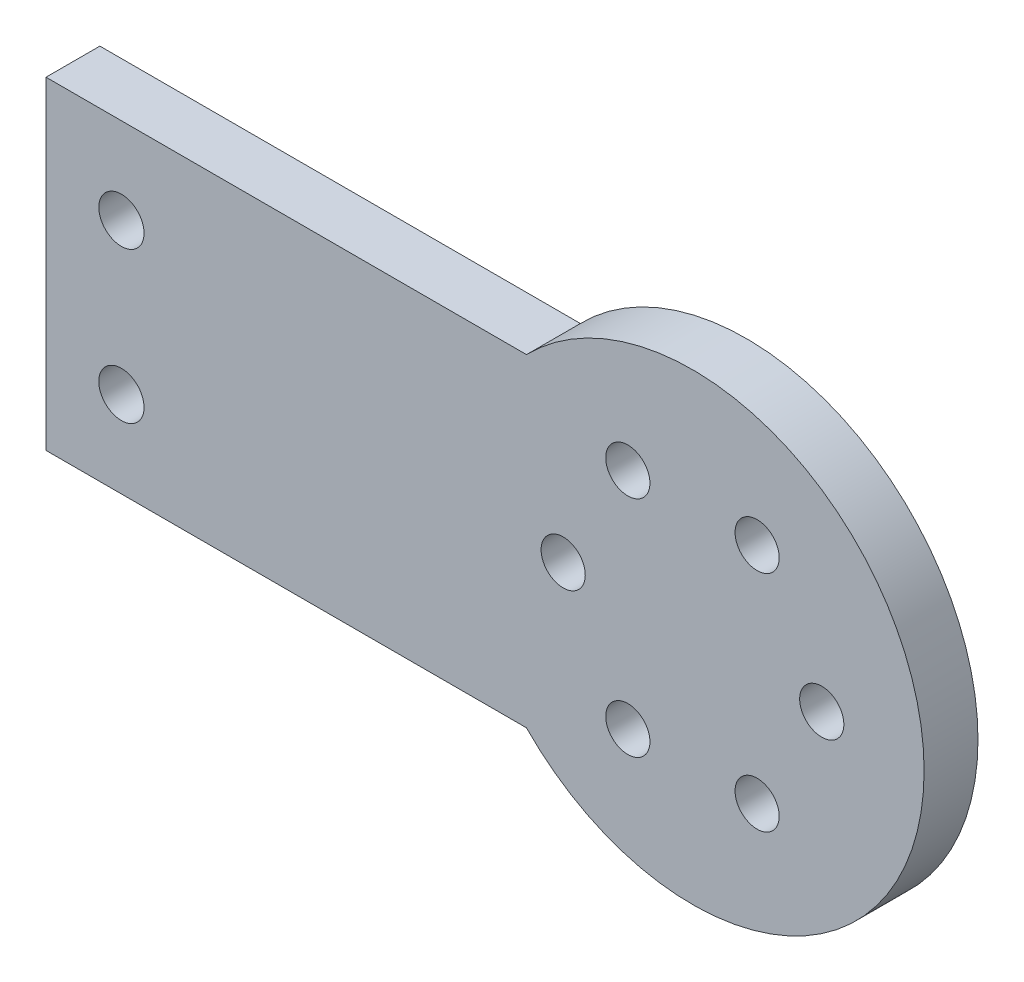
ISO-10303-21;
HEADER;
FILE_DESCRIPTION(('STEP AP214'),'2;1');
FILE_NAME('part.step','',(''),(''),'','','');
FILE_SCHEMA(('AUTOMOTIVE_DESIGN { 1 0 10303 214 1 1 1 1 }'));
ENDSEC;
DATA;
#1=APPLICATION_CONTEXT('core data for automotive mechanical design processes');
#2=APPLICATION_PROTOCOL_DEFINITION('international standard','automotive_design',2000,#1);
#3=PRODUCT_CONTEXT('',#1,'mechanical');
#4=PRODUCT('Part','Part','',(#3));
#5=PRODUCT_RELATED_PRODUCT_CATEGORY('part','',(#4));
#6=PRODUCT_DEFINITION_FORMATION('','',#4);
#7=PRODUCT_DEFINITION_CONTEXT('part definition',#1,'design');
#8=PRODUCT_DEFINITION('design','',#6,#7);
#9=PRODUCT_DEFINITION_SHAPE('','',#8);
#10=(LENGTH_UNIT() NAMED_UNIT(*) SI_UNIT(.MILLI.,.METRE.));
#11=(NAMED_UNIT(*) PLANE_ANGLE_UNIT() SI_UNIT($,.RADIAN.));
#12=(NAMED_UNIT(*) SI_UNIT($,.STERADIAN.) SOLID_ANGLE_UNIT());
#13=UNCERTAINTY_MEASURE_WITH_UNIT(LENGTH_MEASURE(1.E-05),#10,'distance_accuracy_value','');
#14=(GEOMETRIC_REPRESENTATION_CONTEXT(3) GLOBAL_UNCERTAINTY_ASSIGNED_CONTEXT((#13)) GLOBAL_UNIT_ASSIGNED_CONTEXT((#10,
#11,#12)) REPRESENTATION_CONTEXT('',''));
#15=CARTESIAN_POINT('',(0.,0.,0.));
#16=DIRECTION('',(0.,0.,1.));
#17=DIRECTION('',(1.,0.,0.));
#18=AXIS2_PLACEMENT_3D('',#15,#16,#17);
#19=CARTESIAN_POINT('',(0.,0.,5.));
#20=DIRECTION('',(0.,0.,-1.));
#21=DIRECTION('',(-1.,0.,0.));
#22=AXIS2_PLACEMENT_3D('',#19,#20,#21);
#23=PLANE('',#22);
#24=CARTESIAN_POINT('',(-53.,6.99999999999999,5.));
#25=DIRECTION('',(0.,0.,1.));
#26=DIRECTION('',(1.,0.,0.));
#27=AXIS2_PLACEMENT_3D('',#24,#25,#26);
#28=CIRCLE('',#27,2.1);
#29=CARTESIAN_POINT('',(-50.9,6.99999999999999,5.));
#30=VERTEX_POINT('',#29);
#31=EDGE_CURVE('E162',#30,#30,#28,.T.);
#32=ORIENTED_EDGE('',*,*,#31,.F.);
#33=EDGE_LOOP('',(#32));
#34=FACE_BOUND('',#33,.T.);
#35=CARTESIAN_POINT('',(-53.,-7.00000000000001,5.));
#36=DIRECTION('',(0.,0.,1.));
#37=DIRECTION('',(1.,0.,0.));
#38=AXIS2_PLACEMENT_3D('',#35,#36,#37);
#39=CIRCLE('',#38,2.1);
#40=CARTESIAN_POINT('',(-50.9,-7.00000000000001,5.));
#41=VERTEX_POINT('',#40);
#42=EDGE_CURVE('E159',#41,#41,#39,.T.);
#43=ORIENTED_EDGE('',*,*,#42,.F.);
#44=EDGE_LOOP('',(#43));
#45=FACE_BOUND('',#44,.T.);
#46=CARTESIAN_POINT('',(0.,0.,5.));
#47=DIRECTION('',(0.,0.,1.));
#48=DIRECTION('',(-1.,0.,0.));
#49=AXIS2_PLACEMENT_3D('',#46,#47,#48);
#50=CIRCLE('',#49,21.5);
#51=CARTESIAN_POINT('',(-15.4029218007493,-15.,5.));
#52=VERTEX_POINT('',#51);
#53=CARTESIAN_POINT('',(-15.4029218007494,15.,5.));
#54=VERTEX_POINT('',#53);
#55=EDGE_CURVE('E92',#52,#54,#50,.T.);
#56=ORIENTED_EDGE('',*,*,#55,.T.);
#57=DIRECTION('',(-1.,0.,0.));
#58=VECTOR('',#57,1.);
#59=CARTESIAN_POINT('',(-60.,15.,5.));
#60=LINE('',#59,#58);
#61=CARTESIAN_POINT('',(-60.,15.,5.));
#62=VERTEX_POINT('',#61);
#63=EDGE_CURVE('E87',#54,#62,#60,.T.);
#64=ORIENTED_EDGE('',*,*,#63,.T.);
#65=DIRECTION('',(0.,-1.,0.));
#66=VECTOR('',#65,1.);
#67=CARTESIAN_POINT('',(-60.,0.,5.));
#68=LINE('',#67,#66);
#69=CARTESIAN_POINT('',(-60.,-15.,5.));
#70=VERTEX_POINT('',#69);
#71=EDGE_CURVE('E90',#62,#70,#68,.T.);
#72=ORIENTED_EDGE('',*,*,#71,.T.);
#73=DIRECTION('',(1.,0.,0.));
#74=VECTOR('',#73,1.);
#75=CARTESIAN_POINT('',(-60.,-15.,5.));
#76=LINE('',#75,#74);
#77=EDGE_CURVE('E58',#70,#52,#76,.T.);
#78=ORIENTED_EDGE('',*,*,#77,.T.);
#79=EDGE_LOOP('',(#56,#64,#72,#78));
#80=FACE_BOUND('',#79,.T.);
#81=CARTESIAN_POINT('',(12.,0.,5.));
#82=DIRECTION('',(0.,0.,1.));
#83=DIRECTION('',(1.,0.,0.));
#84=AXIS2_PLACEMENT_3D('',#81,#82,#83);
#85=CIRCLE('',#84,2.05);
#86=CARTESIAN_POINT('',(14.05,0.,5.));
#87=VERTEX_POINT('',#86);
#88=EDGE_CURVE('E108',#87,#87,#85,.T.);
#89=ORIENTED_EDGE('',*,*,#88,.F.);
#90=EDGE_LOOP('',(#89));
#91=FACE_BOUND('',#90,.T.);
#92=CARTESIAN_POINT('',(5.99999999999998,-10.3923048454133,5.));
#93=DIRECTION('',(0.,0.,1.));
#94=DIRECTION('',(1.,0.,0.));
#95=AXIS2_PLACEMENT_3D('',#92,#93,#94);
#96=CIRCLE('',#95,2.05);
#97=CARTESIAN_POINT('',(8.04999999999998,-10.3923048454133,5.));
#98=VERTEX_POINT('',#97);
#99=EDGE_CURVE('E123',#98,#98,#96,.T.);
#100=ORIENTED_EDGE('',*,*,#99,.F.);
#101=EDGE_LOOP('',(#100));
#102=FACE_BOUND('',#101,.T.);
#103=CARTESIAN_POINT('',(-6.00000000000005,-10.3923048454132,5.));
#104=DIRECTION('',(0.,0.,1.));
#105=DIRECTION('',(1.,0.,0.));
#106=AXIS2_PLACEMENT_3D('',#103,#104,#105);
#107=CIRCLE('',#106,2.05);
#108=CARTESIAN_POINT('',(-3.95000000000005,-10.3923048454132,5.));
#109=VERTEX_POINT('',#108);
#110=EDGE_CURVE('E129',#109,#109,#107,.T.);
#111=ORIENTED_EDGE('',*,*,#110,.F.);
#112=EDGE_LOOP('',(#111));
#113=FACE_BOUND('',#112,.T.);
#114=CARTESIAN_POINT('',(-12.,0.,5.));
#115=DIRECTION('',(0.,0.,1.));
#116=DIRECTION('',(1.,0.,0.));
#117=AXIS2_PLACEMENT_3D('',#114,#115,#116);
#118=CIRCLE('',#117,2.05);
#119=CARTESIAN_POINT('',(-9.95,0.,5.));
#120=VERTEX_POINT('',#119);
#121=EDGE_CURVE('E135',#120,#120,#118,.T.);
#122=ORIENTED_EDGE('',*,*,#121,.F.);
#123=EDGE_LOOP('',(#122));
#124=FACE_BOUND('',#123,.T.);
#125=CARTESIAN_POINT('',(-5.9999999999999,10.3923048454133,5.));
#126=DIRECTION('',(0.,0.,1.));
#127=DIRECTION('',(1.,0.,0.));
#128=AXIS2_PLACEMENT_3D('',#125,#126,#127);
#129=CIRCLE('',#128,2.05);
#130=CARTESIAN_POINT('',(-3.94999999999991,10.3923048454133,5.));
#131=VERTEX_POINT('',#130);
#132=EDGE_CURVE('E141',#131,#131,#129,.T.);
#133=ORIENTED_EDGE('',*,*,#132,.F.);
#134=EDGE_LOOP('',(#133));
#135=FACE_BOUND('',#134,.T.);
#136=CARTESIAN_POINT('',(6.00000000000012,10.3923048454132,5.));
#137=DIRECTION('',(0.,0.,1.));
#138=DIRECTION('',(1.,0.,0.));
#139=AXIS2_PLACEMENT_3D('',#136,#137,#138);
#140=CIRCLE('',#139,2.05);
#141=CARTESIAN_POINT('',(8.05000000000012,10.3923048454132,5.));
#142=VERTEX_POINT('',#141);
#143=EDGE_CURVE('E147',#142,#142,#140,.T.);
#144=ORIENTED_EDGE('',*,*,#143,.F.);
#145=EDGE_LOOP('',(#144));
#146=FACE_BOUND('',#145,.T.);
#147=ADVANCED_FACE('F41',(#34,#45,#80,#91,#102,#113,#124,#135,#146),#23,.F.);
#148=CARTESIAN_POINT('',(0.,0.,0.));
#149=DIRECTION('',(0.,0.,-1.));
#150=DIRECTION('',(-1.,0.,0.));
#151=AXIS2_PLACEMENT_3D('',#148,#149,#150);
#152=PLANE('',#151);
#153=CARTESIAN_POINT('',(-53.,6.99999999999999,0.));
#154=DIRECTION('',(0.,0.,1.));
#155=DIRECTION('',(1.,0.,0.));
#156=AXIS2_PLACEMENT_3D('',#153,#154,#155);
#157=CIRCLE('',#156,2.1);
#158=CARTESIAN_POINT('',(-50.9,6.99999999999999,0.));
#159=VERTEX_POINT('',#158);
#160=EDGE_CURVE('E153',#159,#159,#157,.T.);
#161=ORIENTED_EDGE('',*,*,#160,.T.);
#162=EDGE_LOOP('',(#161));
#163=FACE_BOUND('',#162,.T.);
#164=CARTESIAN_POINT('',(-53.,-7.00000000000001,0.));
#165=DIRECTION('',(0.,0.,1.));
#166=DIRECTION('',(1.,0.,0.));
#167=AXIS2_PLACEMENT_3D('',#164,#165,#166);
#168=CIRCLE('',#167,2.1);
#169=CARTESIAN_POINT('',(-50.9,-7.00000000000001,0.));
#170=VERTEX_POINT('',#169);
#171=EDGE_CURVE('E156',#170,#170,#168,.T.);
#172=ORIENTED_EDGE('',*,*,#171,.T.);
#173=EDGE_LOOP('',(#172));
#174=FACE_BOUND('',#173,.T.);
#175=CARTESIAN_POINT('',(-5.9999999999999,10.3923048454133,0.));
#176=DIRECTION('',(0.,0.,1.));
#177=DIRECTION('',(1.,0.,0.));
#178=AXIS2_PLACEMENT_3D('',#175,#176,#177);
#179=CIRCLE('',#178,2.05);
#180=CARTESIAN_POINT('',(-3.94999999999991,10.3923048454133,0.));
#181=VERTEX_POINT('',#180);
#182=EDGE_CURVE('E144',#181,#181,#179,.T.);
#183=ORIENTED_EDGE('',*,*,#182,.T.);
#184=EDGE_LOOP('',(#183));
#185=FACE_BOUND('',#184,.T.);
#186=CARTESIAN_POINT('',(-6.00000000000005,-10.3923048454132,0.));
#187=DIRECTION('',(0.,0.,1.));
#188=DIRECTION('',(1.,0.,0.));
#189=AXIS2_PLACEMENT_3D('',#186,#187,#188);
#190=CIRCLE('',#189,2.05);
#191=CARTESIAN_POINT('',(-3.95000000000005,-10.3923048454132,0.));
#192=VERTEX_POINT('',#191);
#193=EDGE_CURVE('E132',#192,#192,#190,.T.);
#194=ORIENTED_EDGE('',*,*,#193,.T.);
#195=EDGE_LOOP('',(#194));
#196=FACE_BOUND('',#195,.T.);
#197=CARTESIAN_POINT('',(12.,0.,0.));
#198=DIRECTION('',(0.,0.,1.));
#199=DIRECTION('',(1.,0.,0.));
#200=AXIS2_PLACEMENT_3D('',#197,#198,#199);
#201=CIRCLE('',#200,2.05);
#202=CARTESIAN_POINT('',(14.05,0.,0.));
#203=VERTEX_POINT('',#202);
#204=EDGE_CURVE('E120',#203,#203,#201,.T.);
#205=ORIENTED_EDGE('',*,*,#204,.T.);
#206=EDGE_LOOP('',(#205));
#207=FACE_BOUND('',#206,.T.);
#208=CARTESIAN_POINT('',(0.,0.,0.));
#209=DIRECTION('',(0.,0.,1.));
#210=DIRECTION('',(-1.,0.,0.));
#211=AXIS2_PLACEMENT_3D('',#208,#209,#210);
#212=CIRCLE('',#211,21.5);
#213=CARTESIAN_POINT('',(-15.4029218007493,-15.,0.));
#214=VERTEX_POINT('',#213);
#215=CARTESIAN_POINT('',(-15.4029218007494,15.,0.));
#216=VERTEX_POINT('',#215);
#217=EDGE_CURVE('E105',#214,#216,#212,.T.);
#218=ORIENTED_EDGE('',*,*,#217,.F.);
#219=DIRECTION('',(1.,0.,0.));
#220=VECTOR('',#219,1.);
#221=CARTESIAN_POINT('',(-60.,-15.,0.));
#222=LINE('',#221,#220);
#223=CARTESIAN_POINT('',(-60.,-15.,0.));
#224=VERTEX_POINT('',#223);
#225=EDGE_CURVE('E80',#224,#214,#222,.T.);
#226=ORIENTED_EDGE('',*,*,#225,.F.);
#227=DIRECTION('',(0.,-1.,0.));
#228=VECTOR('',#227,1.);
#229=CARTESIAN_POINT('',(-60.,0.,0.));
#230=LINE('',#229,#228);
#231=CARTESIAN_POINT('',(-60.,15.,0.));
#232=VERTEX_POINT('',#231);
#233=EDGE_CURVE('E74',#232,#224,#230,.T.);
#234=ORIENTED_EDGE('',*,*,#233,.F.);
#235=DIRECTION('',(-1.,0.,0.));
#236=VECTOR('',#235,1.);
#237=CARTESIAN_POINT('',(-60.,15.,0.));
#238=LINE('',#237,#236);
#239=EDGE_CURVE('E97',#216,#232,#238,.T.);
#240=ORIENTED_EDGE('',*,*,#239,.F.);
#241=EDGE_LOOP('',(#218,#226,#234,#240));
#242=FACE_BOUND('',#241,.T.);
#243=CARTESIAN_POINT('',(5.99999999999998,-10.3923048454133,0.));
#244=DIRECTION('',(0.,0.,1.));
#245=DIRECTION('',(1.,0.,0.));
#246=AXIS2_PLACEMENT_3D('',#243,#244,#245);
#247=CIRCLE('',#246,2.05);
#248=CARTESIAN_POINT('',(8.04999999999998,-10.3923048454133,0.));
#249=VERTEX_POINT('',#248);
#250=EDGE_CURVE('E126',#249,#249,#247,.T.);
#251=ORIENTED_EDGE('',*,*,#250,.T.);
#252=EDGE_LOOP('',(#251));
#253=FACE_BOUND('',#252,.T.);
#254=CARTESIAN_POINT('',(-12.,0.,0.));
#255=DIRECTION('',(0.,0.,1.));
#256=DIRECTION('',(1.,0.,0.));
#257=AXIS2_PLACEMENT_3D('',#254,#255,#256);
#258=CIRCLE('',#257,2.05);
#259=CARTESIAN_POINT('',(-9.95,0.,0.));
#260=VERTEX_POINT('',#259);
#261=EDGE_CURVE('E138',#260,#260,#258,.T.);
#262=ORIENTED_EDGE('',*,*,#261,.T.);
#263=EDGE_LOOP('',(#262));
#264=FACE_BOUND('',#263,.T.);
#265=CARTESIAN_POINT('',(6.00000000000012,10.3923048454132,0.));
#266=DIRECTION('',(0.,0.,1.));
#267=DIRECTION('',(1.,0.,0.));
#268=AXIS2_PLACEMENT_3D('',#265,#266,#267);
#269=CIRCLE('',#268,2.05);
#270=CARTESIAN_POINT('',(8.05000000000012,10.3923048454132,0.));
#271=VERTEX_POINT('',#270);
#272=EDGE_CURVE('E150',#271,#271,#269,.T.);
#273=ORIENTED_EDGE('',*,*,#272,.T.);
#274=EDGE_LOOP('',(#273));
#275=FACE_BOUND('',#274,.T.);
#276=ADVANCED_FACE('F116',(#163,#174,#185,#196,#207,#242,#253,#264,#275),#152,.T.);
#277=CARTESIAN_POINT('',(0.,0.,5.));
#278=DIRECTION('',(0.,0.,-1.));
#279=DIRECTION('',(-1.,0.,0.));
#280=AXIS2_PLACEMENT_3D('',#277,#278,#279);
#281=CYLINDRICAL_SURFACE('',#280,21.5);
#282=ORIENTED_EDGE('',*,*,#217,.T.);
#283=DIRECTION('',(0.,0.,-1.));
#284=VECTOR('',#283,1.);
#285=CARTESIAN_POINT('',(-15.4029218007494,15.,5.));
#286=LINE('',#285,#284);
#287=EDGE_CURVE('E11',#54,#216,#286,.T.);
#288=ORIENTED_EDGE('',*,*,#287,.F.);
#289=ORIENTED_EDGE('',*,*,#55,.F.);
#290=DIRECTION('',(0.,0.,-1.));
#291=VECTOR('',#290,1.);
#292=CARTESIAN_POINT('',(-15.4029218007493,-15.,5.));
#293=LINE('',#292,#291);
#294=EDGE_CURVE('E101',#52,#214,#293,.T.);
#295=ORIENTED_EDGE('',*,*,#294,.T.);
#296=EDGE_LOOP('',(#282,#288,#289,#295));
#297=FACE_BOUND('',#296,.T.);
#298=ADVANCED_FACE('F43',(#297),#281,.T.);
#299=CARTESIAN_POINT('',(-60.,15.,5.));
#300=DIRECTION('',(0.,-1.,0.));
#301=DIRECTION('',(1.,0.,0.));
#302=AXIS2_PLACEMENT_3D('',#299,#300,#301);
#303=PLANE('',#302);
#304=ORIENTED_EDGE('',*,*,#239,.T.);
#305=DIRECTION('',(0.,0.,-1.));
#306=VECTOR('',#305,1.);
#307=CARTESIAN_POINT('',(-60.,15.,5.));
#308=LINE('',#307,#306);
#309=EDGE_CURVE('E50',#62,#232,#308,.T.);
#310=ORIENTED_EDGE('',*,*,#309,.F.);
#311=ORIENTED_EDGE('',*,*,#63,.F.);
#312=ORIENTED_EDGE('',*,*,#287,.T.);
#313=EDGE_LOOP('',(#304,#310,#311,#312));
#314=FACE_BOUND('',#313,.T.);
#315=ADVANCED_FACE('F96',(#314),#303,.F.);
#316=CARTESIAN_POINT('',(-60.,0.,5.));
#317=DIRECTION('',(1.,0.,0.));
#318=DIRECTION('',(0.,0.,-1.));
#319=AXIS2_PLACEMENT_3D('',#316,#317,#318);
#320=PLANE('',#319);
#321=ORIENTED_EDGE('',*,*,#233,.T.);
#322=DIRECTION('',(0.,0.,-1.));
#323=VECTOR('',#322,1.);
#324=CARTESIAN_POINT('',(-60.,-15.,5.));
#325=LINE('',#324,#323);
#326=EDGE_CURVE('E98',#70,#224,#325,.T.);
#327=ORIENTED_EDGE('',*,*,#326,.F.);
#328=ORIENTED_EDGE('',*,*,#71,.F.);
#329=ORIENTED_EDGE('',*,*,#309,.T.);
#330=EDGE_LOOP('',(#321,#327,#328,#329));
#331=FACE_BOUND('',#330,.T.);
#332=ADVANCED_FACE('F99',(#331),#320,.F.);
#333=CARTESIAN_POINT('',(-60.,-15.,5.));
#334=DIRECTION('',(0.,1.,0.));
#335=DIRECTION('',(-1.,0.,0.));
#336=AXIS2_PLACEMENT_3D('',#333,#334,#335);
#337=PLANE('',#336);
#338=ORIENTED_EDGE('',*,*,#225,.T.);
#339=ORIENTED_EDGE('',*,*,#294,.F.);
#340=ORIENTED_EDGE('',*,*,#77,.F.);
#341=ORIENTED_EDGE('',*,*,#326,.T.);
#342=EDGE_LOOP('',(#338,#339,#340,#341));
#343=FACE_BOUND('',#342,.T.);
#344=ADVANCED_FACE('F113',(#343),#337,.F.);
#345=CARTESIAN_POINT('',(12.,0.,5.));
#346=DIRECTION('',(0.,0.,-1.));
#347=DIRECTION('',(-1.,0.,0.));
#348=AXIS2_PLACEMENT_3D('',#345,#346,#347);
#349=CYLINDRICAL_SURFACE('',#348,2.05);
#350=ORIENTED_EDGE('',*,*,#88,.T.);
#351=EDGE_LOOP('',(#350));
#352=FACE_BOUND('',#351,.T.);
#353=ORIENTED_EDGE('',*,*,#204,.F.);
#354=EDGE_LOOP('',(#353));
#355=FACE_BOUND('',#354,.T.);
#356=ADVANCED_FACE('F209',(#352,#355),#349,.F.);
#357=CARTESIAN_POINT('',(5.99999999999998,-10.3923048454133,5.));
#358=DIRECTION('',(0.,0.,-1.));
#359=DIRECTION('',(-1.,0.,0.));
#360=AXIS2_PLACEMENT_3D('',#357,#358,#359);
#361=CYLINDRICAL_SURFACE('',#360,2.05);
#362=ORIENTED_EDGE('',*,*,#99,.T.);
#363=EDGE_LOOP('',(#362));
#364=FACE_BOUND('',#363,.T.);
#365=ORIENTED_EDGE('',*,*,#250,.F.);
#366=EDGE_LOOP('',(#365));
#367=FACE_BOUND('',#366,.T.);
#368=ADVANCED_FACE('F205',(#364,#367),#361,.F.);
#369=CARTESIAN_POINT('',(-6.00000000000005,-10.3923048454132,5.));
#370=DIRECTION('',(0.,0.,-1.));
#371=DIRECTION('',(-1.,0.,0.));
#372=AXIS2_PLACEMENT_3D('',#369,#370,#371);
#373=CYLINDRICAL_SURFACE('',#372,2.05);
#374=ORIENTED_EDGE('',*,*,#110,.T.);
#375=EDGE_LOOP('',(#374));
#376=FACE_BOUND('',#375,.T.);
#377=ORIENTED_EDGE('',*,*,#193,.F.);
#378=EDGE_LOOP('',(#377));
#379=FACE_BOUND('',#378,.T.);
#380=ADVANCED_FACE('F201',(#376,#379),#373,.F.);
#381=CARTESIAN_POINT('',(-12.,0.,5.));
#382=DIRECTION('',(0.,0.,-1.));
#383=DIRECTION('',(-1.,0.,0.));
#384=AXIS2_PLACEMENT_3D('',#381,#382,#383);
#385=CYLINDRICAL_SURFACE('',#384,2.05);
#386=ORIENTED_EDGE('',*,*,#121,.T.);
#387=EDGE_LOOP('',(#386));
#388=FACE_BOUND('',#387,.T.);
#389=ORIENTED_EDGE('',*,*,#261,.F.);
#390=EDGE_LOOP('',(#389));
#391=FACE_BOUND('',#390,.T.);
#392=ADVANCED_FACE('F197',(#388,#391),#385,.F.);
#393=CARTESIAN_POINT('',(-5.9999999999999,10.3923048454133,5.));
#394=DIRECTION('',(0.,0.,-1.));
#395=DIRECTION('',(-1.,0.,0.));
#396=AXIS2_PLACEMENT_3D('',#393,#394,#395);
#397=CYLINDRICAL_SURFACE('',#396,2.05);
#398=ORIENTED_EDGE('',*,*,#132,.T.);
#399=EDGE_LOOP('',(#398));
#400=FACE_BOUND('',#399,.T.);
#401=ORIENTED_EDGE('',*,*,#182,.F.);
#402=EDGE_LOOP('',(#401));
#403=FACE_BOUND('',#402,.T.);
#404=ADVANCED_FACE('F190',(#400,#403),#397,.F.);
#405=CARTESIAN_POINT('',(6.00000000000012,10.3923048454132,5.));
#406=DIRECTION('',(0.,0.,-1.));
#407=DIRECTION('',(-1.,0.,0.));
#408=AXIS2_PLACEMENT_3D('',#405,#406,#407);
#409=CYLINDRICAL_SURFACE('',#408,2.05);
#410=ORIENTED_EDGE('',*,*,#143,.T.);
#411=EDGE_LOOP('',(#410));
#412=FACE_BOUND('',#411,.T.);
#413=ORIENTED_EDGE('',*,*,#272,.F.);
#414=EDGE_LOOP('',(#413));
#415=FACE_BOUND('',#414,.T.);
#416=ADVANCED_FACE('F183',(#412,#415),#409,.F.);
#417=CARTESIAN_POINT('',(-53.,-7.00000000000001,0.));
#418=DIRECTION('',(0.,0.,1.));
#419=DIRECTION('',(1.,0.,0.));
#420=AXIS2_PLACEMENT_3D('',#417,#418,#419);
#421=CYLINDRICAL_SURFACE('',#420,2.1);
#422=ORIENTED_EDGE('',*,*,#171,.F.);
#423=EDGE_LOOP('',(#422));
#424=FACE_BOUND('',#423,.T.);
#425=ORIENTED_EDGE('',*,*,#42,.T.);
#426=EDGE_LOOP('',(#425));
#427=FACE_BOUND('',#426,.T.);
#428=ADVANCED_FACE('F173',(#424,#427),#421,.F.);
#429=CARTESIAN_POINT('',(-53.,6.99999999999999,0.));
#430=DIRECTION('',(0.,0.,1.));
#431=DIRECTION('',(1.,0.,0.));
#432=AXIS2_PLACEMENT_3D('',#429,#430,#431);
#433=CYLINDRICAL_SURFACE('',#432,2.1);
#434=ORIENTED_EDGE('',*,*,#160,.F.);
#435=EDGE_LOOP('',(#434));
#436=FACE_BOUND('',#435,.T.);
#437=ORIENTED_EDGE('',*,*,#31,.T.);
#438=EDGE_LOOP('',(#437));
#439=FACE_BOUND('',#438,.T.);
#440=ADVANCED_FACE('F170',(#436,#439),#433,.F.);
#441=CLOSED_SHELL('',(#147,#276,#298,#315,#332,#344,#356,#368,#380,#392,#404,#416,#428,#440));
#442=MANIFOLD_SOLID_BREP('B2',#441);
#443=ADVANCED_BREP_SHAPE_REPRESENTATION('',(#18,#442),#14);
#444=SHAPE_DEFINITION_REPRESENTATION(#9,#443);
ENDSEC;
END-ISO-10303-21;
